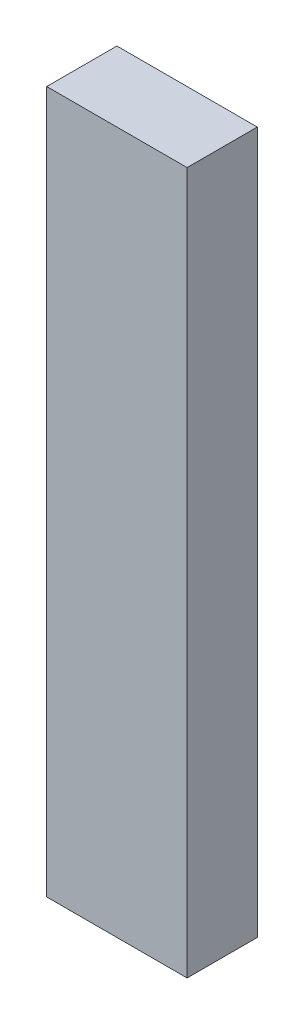
ISO-10303-21;
HEADER;
FILE_DESCRIPTION(('STEP AP214'),'2;1');
FILE_NAME('part.step','',(''),(''),'','','');
FILE_SCHEMA(('AUTOMOTIVE_DESIGN { 1 0 10303 214 1 1 1 1 }'));
ENDSEC;
DATA;
#1=APPLICATION_CONTEXT('core data for automotive mechanical design processes');
#2=APPLICATION_PROTOCOL_DEFINITION('international standard','automotive_design',2000,#1);
#3=PRODUCT_CONTEXT('',#1,'mechanical');
#4=PRODUCT('Part','Part','',(#3));
#5=PRODUCT_RELATED_PRODUCT_CATEGORY('part','',(#4));
#6=PRODUCT_DEFINITION_FORMATION('','',#4);
#7=PRODUCT_DEFINITION_CONTEXT('part definition',#1,'design');
#8=PRODUCT_DEFINITION('design','',#6,#7);
#9=PRODUCT_DEFINITION_SHAPE('','',#8);
#10=(LENGTH_UNIT() NAMED_UNIT(*) SI_UNIT(.MILLI.,.METRE.));
#11=(NAMED_UNIT(*) PLANE_ANGLE_UNIT() SI_UNIT($,.RADIAN.));
#12=(NAMED_UNIT(*) SI_UNIT($,.STERADIAN.) SOLID_ANGLE_UNIT());
#13=UNCERTAINTY_MEASURE_WITH_UNIT(LENGTH_MEASURE(1.E-05),#10,'distance_accuracy_value','');
#14=(GEOMETRIC_REPRESENTATION_CONTEXT(3) GLOBAL_UNCERTAINTY_ASSIGNED_CONTEXT((#13)) GLOBAL_UNIT_ASSIGNED_CONTEXT((#10,
#11,#12)) REPRESENTATION_CONTEXT('',''));
#15=CARTESIAN_POINT('',(0.,0.,0.));
#16=DIRECTION('',(0.,0.,1.));
#17=DIRECTION('',(1.,0.,0.));
#18=AXIS2_PLACEMENT_3D('',#15,#16,#17);
#19=CARTESIAN_POINT('',(-4.,41.,-2.00000000000001));
#20=DIRECTION('',(1.,0.,0.));
#21=DIRECTION('',(0.,0.,-1.));
#22=AXIS2_PLACEMENT_3D('',#19,#20,#21);
#23=PLANE('',#22);
#24=DIRECTION('',(0.,0.,1.));
#25=VECTOR('',#24,1.);
#26=CARTESIAN_POINT('',(-4.,1.,-2.00000000000001));
#27=LINE('',#26,#25);
#28=CARTESIAN_POINT('',(-4.,1.,-2.00000000000001));
#29=VERTEX_POINT('',#28);
#30=CARTESIAN_POINT('',(-4.,1.,1.99999999999999));
#31=VERTEX_POINT('',#30);
#32=EDGE_CURVE('E96',#29,#31,#27,.T.);
#33=ORIENTED_EDGE('',*,*,#32,.T.);
#34=DIRECTION('',(0.,-1.,0.));
#35=VECTOR('',#34,1.);
#36=CARTESIAN_POINT('',(-4.,41.,1.99999999999999));
#37=LINE('',#36,#35);
#38=CARTESIAN_POINT('',(-4.,41.,1.99999999999999));
#39=VERTEX_POINT('',#38);
#40=EDGE_CURVE('E11',#39,#31,#37,.T.);
#41=ORIENTED_EDGE('',*,*,#40,.F.);
#42=DIRECTION('',(0.,0.,1.));
#43=VECTOR('',#42,1.);
#44=CARTESIAN_POINT('',(-4.,41.,-2.00000000000001));
#45=LINE('',#44,#43);
#46=CARTESIAN_POINT('',(-4.,41.,-2.00000000000001));
#47=VERTEX_POINT('',#46);
#48=EDGE_CURVE('E84',#47,#39,#45,.T.);
#49=ORIENTED_EDGE('',*,*,#48,.F.);
#50=DIRECTION('',(0.,-1.,0.));
#51=VECTOR('',#50,1.);
#52=CARTESIAN_POINT('',(-4.,41.,-2.00000000000001));
#53=LINE('',#52,#51);
#54=EDGE_CURVE('E92',#47,#29,#53,.T.);
#55=ORIENTED_EDGE('',*,*,#54,.T.);
#56=EDGE_LOOP('',(#33,#41,#49,#55));
#57=FACE_BOUND('',#56,.T.);
#58=ADVANCED_FACE('F33',(#57),#23,.F.);
#59=CARTESIAN_POINT('',(-4.,41.,1.99999999999999));
#60=DIRECTION('',(0.,0.,-1.));
#61=DIRECTION('',(-1.,0.,0.));
#62=AXIS2_PLACEMENT_3D('',#59,#60,#61);
#63=PLANE('',#62);
#64=DIRECTION('',(1.,0.,0.));
#65=VECTOR('',#64,1.);
#66=CARTESIAN_POINT('',(-4.,1.,1.99999999999999));
#67=LINE('',#66,#65);
#68=CARTESIAN_POINT('',(3.99999999999999,1.,1.99999999999999));
#69=VERTEX_POINT('',#68);
#70=EDGE_CURVE('E88',#31,#69,#67,.T.);
#71=ORIENTED_EDGE('',*,*,#70,.T.);
#72=DIRECTION('',(0.,-1.,0.));
#73=VECTOR('',#72,1.);
#74=CARTESIAN_POINT('',(3.99999999999999,41.,1.99999999999999));
#75=LINE('',#74,#73);
#76=CARTESIAN_POINT('',(3.99999999999999,41.,1.99999999999999));
#77=VERTEX_POINT('',#76);
#78=EDGE_CURVE('E41',#77,#69,#75,.T.);
#79=ORIENTED_EDGE('',*,*,#78,.F.);
#80=DIRECTION('',(1.,0.,0.));
#81=VECTOR('',#80,1.);
#82=CARTESIAN_POINT('',(-4.,41.,1.99999999999999));
#83=LINE('',#82,#81);
#84=EDGE_CURVE('E79',#39,#77,#83,.T.);
#85=ORIENTED_EDGE('',*,*,#84,.F.);
#86=ORIENTED_EDGE('',*,*,#40,.T.);
#87=EDGE_LOOP('',(#71,#79,#85,#86));
#88=FACE_BOUND('',#87,.T.);
#89=ADVANCED_FACE('F87',(#88),#63,.F.);
#90=CARTESIAN_POINT('',(3.99999999999999,41.,-2.00000000000001));
#91=DIRECTION('',(-1.,0.,0.));
#92=DIRECTION('',(0.,0.,1.));
#93=AXIS2_PLACEMENT_3D('',#90,#91,#92);
#94=PLANE('',#93);
#95=DIRECTION('',(0.,0.,-1.));
#96=VECTOR('',#95,1.);
#97=CARTESIAN_POINT('',(3.99999999999999,1.,-2.00000000000001));
#98=LINE('',#97,#96);
#99=CARTESIAN_POINT('',(3.99999999999999,1.,-2.00000000000001));
#100=VERTEX_POINT('',#99);
#101=EDGE_CURVE('E66',#69,#100,#98,.T.);
#102=ORIENTED_EDGE('',*,*,#101,.T.);
#103=DIRECTION('',(0.,-1.,0.));
#104=VECTOR('',#103,1.);
#105=CARTESIAN_POINT('',(3.99999999999999,41.,-2.00000000000001));
#106=LINE('',#105,#104);
#107=CARTESIAN_POINT('',(3.99999999999999,41.,-2.00000000000001));
#108=VERTEX_POINT('',#107);
#109=EDGE_CURVE('E89',#108,#100,#106,.T.);
#110=ORIENTED_EDGE('',*,*,#109,.F.);
#111=DIRECTION('',(0.,0.,-1.));
#112=VECTOR('',#111,1.);
#113=CARTESIAN_POINT('',(3.99999999999999,41.,-2.00000000000001));
#114=LINE('',#113,#112);
#115=EDGE_CURVE('E82',#77,#108,#114,.T.);
#116=ORIENTED_EDGE('',*,*,#115,.F.);
#117=ORIENTED_EDGE('',*,*,#78,.T.);
#118=EDGE_LOOP('',(#102,#110,#116,#117));
#119=FACE_BOUND('',#118,.T.);
#120=ADVANCED_FACE('F90',(#119),#94,.F.);
#121=CARTESIAN_POINT('',(-4.,41.,-2.00000000000001));
#122=DIRECTION('',(0.,0.,1.));
#123=DIRECTION('',(1.,0.,0.));
#124=AXIS2_PLACEMENT_3D('',#121,#122,#123);
#125=PLANE('',#124);
#126=DIRECTION('',(-1.,0.,0.));
#127=VECTOR('',#126,1.);
#128=CARTESIAN_POINT('',(-4.,1.,-2.00000000000001));
#129=LINE('',#128,#127);
#130=EDGE_CURVE('E72',#100,#29,#129,.T.);
#131=ORIENTED_EDGE('',*,*,#130,.T.);
#132=ORIENTED_EDGE('',*,*,#54,.F.);
#133=DIRECTION('',(-1.,0.,0.));
#134=VECTOR('',#133,1.);
#135=CARTESIAN_POINT('',(-4.,41.,-2.00000000000001));
#136=LINE('',#135,#134);
#137=EDGE_CURVE('E49',#108,#47,#136,.T.);
#138=ORIENTED_EDGE('',*,*,#137,.F.);
#139=ORIENTED_EDGE('',*,*,#109,.T.);
#140=EDGE_LOOP('',(#131,#132,#138,#139));
#141=FACE_BOUND('',#140,.T.);
#142=ADVANCED_FACE('F103',(#141),#125,.F.);
#143=CARTESIAN_POINT('',(0.,41.,0.));
#144=DIRECTION('',(0.,1.,0.));
#145=DIRECTION('',(0.,0.,1.));
#146=AXIS2_PLACEMENT_3D('',#143,#144,#145);
#147=PLANE('',#146);
#148=ORIENTED_EDGE('',*,*,#48,.T.);
#149=ORIENTED_EDGE('',*,*,#84,.T.);
#150=ORIENTED_EDGE('',*,*,#115,.T.);
#151=ORIENTED_EDGE('',*,*,#137,.T.);
#152=EDGE_LOOP('',(#148,#149,#150,#151));
#153=FACE_BOUND('',#152,.T.);
#154=ADVANCED_FACE('F80',(#153),#147,.T.);
#155=CARTESIAN_POINT('',(0.,1.,0.));
#156=DIRECTION('',(0.,1.,0.));
#157=DIRECTION('',(0.,0.,1.));
#158=AXIS2_PLACEMENT_3D('',#155,#156,#157);
#159=PLANE('',#158);
#160=ORIENTED_EDGE('',*,*,#32,.F.);
#161=ORIENTED_EDGE('',*,*,#130,.F.);
#162=ORIENTED_EDGE('',*,*,#101,.F.);
#163=ORIENTED_EDGE('',*,*,#70,.F.);
#164=EDGE_LOOP('',(#160,#161,#162,#163));
#165=FACE_BOUND('',#164,.T.);
#166=ADVANCED_FACE('F106',(#165),#159,.F.);
#167=CLOSED_SHELL('',(#58,#89,#120,#142,#154,#166));
#168=MANIFOLD_SOLID_BREP('B2',#167);
#169=ADVANCED_BREP_SHAPE_REPRESENTATION('',(#18,#168),#14);
#170=SHAPE_DEFINITION_REPRESENTATION(#9,#169);
ENDSEC;
END-ISO-10303-21;
